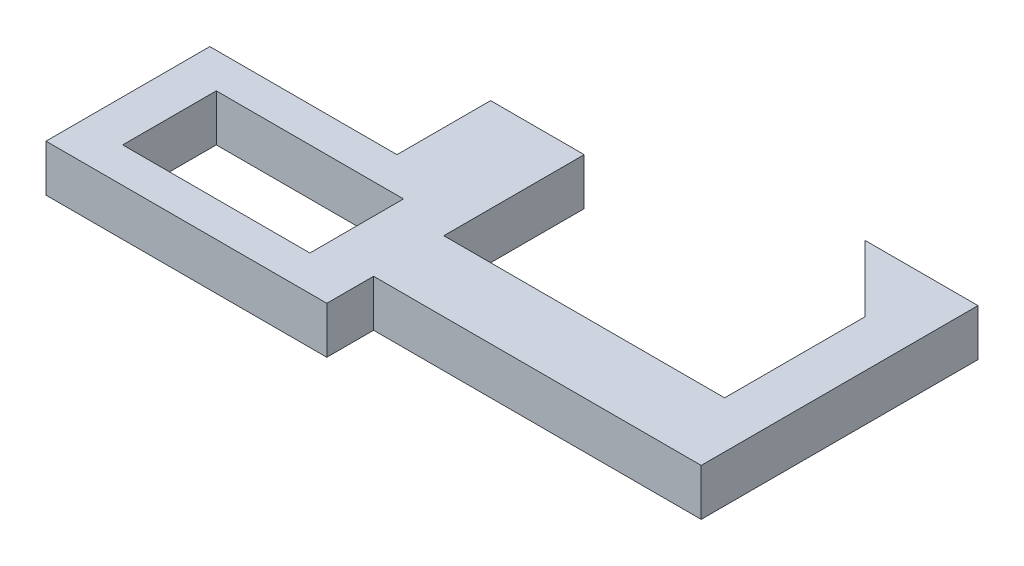
ISO-10303-21;
HEADER;
FILE_DESCRIPTION(('STEP AP214'),'2;1');
FILE_NAME('part.step','',(''),(''),'','','');
FILE_SCHEMA(('AUTOMOTIVE_DESIGN { 1 0 10303 214 1 1 1 1 }'));
ENDSEC;
DATA;
#1=APPLICATION_CONTEXT('core data for automotive mechanical design processes');
#2=APPLICATION_PROTOCOL_DEFINITION('international standard','automotive_design',2000,#1);
#3=PRODUCT_CONTEXT('',#1,'mechanical');
#4=PRODUCT('Part','Part','',(#3));
#5=PRODUCT_RELATED_PRODUCT_CATEGORY('part','',(#4));
#6=PRODUCT_DEFINITION_FORMATION('','',#4);
#7=PRODUCT_DEFINITION_CONTEXT('part definition',#1,'design');
#8=PRODUCT_DEFINITION('design','',#6,#7);
#9=PRODUCT_DEFINITION_SHAPE('','',#8);
#10=(LENGTH_UNIT() NAMED_UNIT(*) SI_UNIT(.MILLI.,.METRE.));
#11=(NAMED_UNIT(*) PLANE_ANGLE_UNIT() SI_UNIT($,.RADIAN.));
#12=(NAMED_UNIT(*) SI_UNIT($,.STERADIAN.) SOLID_ANGLE_UNIT());
#13=UNCERTAINTY_MEASURE_WITH_UNIT(LENGTH_MEASURE(1.E-05),#10,'distance_accuracy_value','');
#14=(GEOMETRIC_REPRESENTATION_CONTEXT(3) GLOBAL_UNCERTAINTY_ASSIGNED_CONTEXT((#13)) GLOBAL_UNIT_ASSIGNED_CONTEXT((#10,
#11,#12)) REPRESENTATION_CONTEXT('',''));
#15=CARTESIAN_POINT('',(0.,0.,0.));
#16=DIRECTION('',(0.,0.,1.));
#17=DIRECTION('',(1.,0.,0.));
#18=AXIS2_PLACEMENT_3D('',#15,#16,#17);
#19=CARTESIAN_POINT('',(0.,0.5,-22.6921827779806));
#20=DIRECTION('',(0.,0.,1.));
#21=DIRECTION('',(1.,0.,0.));
#22=AXIS2_PLACEMENT_3D('',#19,#20,#21);
#23=PLANE('',#22);
#24=DIRECTION('',(-1.,0.,0.));
#25=VECTOR('',#24,1.);
#26=CARTESIAN_POINT('',(0.,0.,-22.6921827779806));
#27=LINE('',#26,#25);
#28=CARTESIAN_POINT('',(-28.9732967707679,0.,-22.6921827779806));
#29=VERTEX_POINT('',#28);
#30=CARTESIAN_POINT('',(-30.9732967707679,0.,-22.6921827779806));
#31=VERTEX_POINT('',#30);
#32=EDGE_CURVE('E304',#29,#31,#27,.T.);
#33=ORIENTED_EDGE('',*,*,#32,.T.);
#34=DIRECTION('',(0.,-1.,0.));
#35=VECTOR('',#34,1.);
#36=CARTESIAN_POINT('',(-30.9732967707679,0.5,-22.6921827779806));
#37=LINE('',#36,#35);
#38=CARTESIAN_POINT('',(-30.9732967707679,0.5,-22.6921827779806));
#39=VERTEX_POINT('',#38);
#40=EDGE_CURVE('E11',#39,#31,#37,.T.);
#41=ORIENTED_EDGE('',*,*,#40,.F.);
#42=DIRECTION('',(-1.,0.,0.));
#43=VECTOR('',#42,1.);
#44=CARTESIAN_POINT('',(0.,0.5,-22.6921827779806));
#45=LINE('',#44,#43);
#46=CARTESIAN_POINT('',(-28.9732967707679,0.5,-22.6921827779806));
#47=VERTEX_POINT('',#46);
#48=EDGE_CURVE('E215',#47,#39,#45,.T.);
#49=ORIENTED_EDGE('',*,*,#48,.F.);
#50=DIRECTION('',(0.,-1.,0.));
#51=VECTOR('',#50,1.);
#52=CARTESIAN_POINT('',(-28.9732967707679,0.5,-22.6921827779806));
#53=LINE('',#52,#51);
#54=EDGE_CURVE('E239',#47,#29,#53,.T.);
#55=ORIENTED_EDGE('',*,*,#54,.T.);
#56=EDGE_LOOP('',(#33,#41,#49,#55));
#57=FACE_BOUND('',#56,.T.);
#58=ADVANCED_FACE('F41',(#57),#23,.F.);
#59=CARTESIAN_POINT('',(-30.9732967707679,0.5,0.));
#60=DIRECTION('',(-1.,0.,0.));
#61=DIRECTION('',(0.,0.,1.));
#62=AXIS2_PLACEMENT_3D('',#59,#60,#61);
#63=PLANE('',#62);
#64=DIRECTION('',(0.,0.,-1.));
#65=VECTOR('',#64,1.);
#66=CARTESIAN_POINT('',(-30.9732967707679,0.,0.));
#67=LINE('',#66,#65);
#68=CARTESIAN_POINT('',(-30.9732967707679,0.,-20.9421827779806));
#69=VERTEX_POINT('',#68);
#70=EDGE_CURVE('E308',#69,#31,#67,.T.);
#71=ORIENTED_EDGE('',*,*,#70,.F.);
#72=DIRECTION('',(0.,-1.,0.));
#73=VECTOR('',#72,1.);
#74=CARTESIAN_POINT('',(-30.9732967707679,0.5,-20.9421827779806));
#75=LINE('',#74,#73);
#76=CARTESIAN_POINT('',(-30.9732967707679,0.5,-20.9421827779806));
#77=VERTEX_POINT('',#76);
#78=EDGE_CURVE('E52',#77,#69,#75,.T.);
#79=ORIENTED_EDGE('',*,*,#78,.F.);
#80=DIRECTION('',(0.,0.,-1.));
#81=VECTOR('',#80,1.);
#82=CARTESIAN_POINT('',(-30.9732967707679,0.5,0.));
#83=LINE('',#82,#81);
#84=EDGE_CURVE('E210',#77,#39,#83,.T.);
#85=ORIENTED_EDGE('',*,*,#84,.T.);
#86=ORIENTED_EDGE('',*,*,#40,.T.);
#87=EDGE_LOOP('',(#71,#79,#85,#86));
#88=FACE_BOUND('',#87,.T.);
#89=ADVANCED_FACE('F367',(#88),#63,.T.);
#90=CARTESIAN_POINT('',(0.,0.5,-20.9421827779806));
#91=DIRECTION('',(0.,0.,1.));
#92=DIRECTION('',(1.,0.,0.));
#93=AXIS2_PLACEMENT_3D('',#90,#91,#92);
#94=PLANE('',#93);
#95=DIRECTION('',(-1.,0.,0.));
#96=VECTOR('',#95,1.);
#97=CARTESIAN_POINT('',(0.,0.,-20.9421827779806));
#98=LINE('',#97,#96);
#99=CARTESIAN_POINT('',(-27.9732967707679,0.,-20.9421827779806));
#100=VERTEX_POINT('',#99);
#101=EDGE_CURVE('E312',#100,#69,#98,.T.);
#102=ORIENTED_EDGE('',*,*,#101,.F.);
#103=DIRECTION('',(0.,-1.,0.));
#104=VECTOR('',#103,1.);
#105=CARTESIAN_POINT('',(-27.9732967707679,0.5,-20.9421827779806));
#106=LINE('',#105,#104);
#107=CARTESIAN_POINT('',(-27.9732967707679,0.5,-20.9421827779806));
#108=VERTEX_POINT('',#107);
#109=EDGE_CURVE('E264',#108,#100,#106,.T.);
#110=ORIENTED_EDGE('',*,*,#109,.F.);
#111=DIRECTION('',(-1.,0.,0.));
#112=VECTOR('',#111,1.);
#113=CARTESIAN_POINT('',(0.,0.5,-20.9421827779806));
#114=LINE('',#113,#112);
#115=EDGE_CURVE('E203',#108,#77,#114,.T.);
#116=ORIENTED_EDGE('',*,*,#115,.T.);
#117=ORIENTED_EDGE('',*,*,#78,.T.);
#118=EDGE_LOOP('',(#102,#110,#116,#117));
#119=FACE_BOUND('',#118,.T.);
#120=ADVANCED_FACE('F372',(#119),#94,.T.);
#121=CARTESIAN_POINT('',(-27.9732967707679,0.5,0.));
#122=DIRECTION('',(1.,0.,0.));
#123=DIRECTION('',(0.,0.,-1.));
#124=AXIS2_PLACEMENT_3D('',#121,#122,#123);
#125=PLANE('',#124);
#126=DIRECTION('',(0.,0.,1.));
#127=VECTOR('',#126,1.);
#128=CARTESIAN_POINT('',(-27.9732967707679,0.,0.));
#129=LINE('',#128,#127);
#130=CARTESIAN_POINT('',(-27.9732967707679,0.,-21.4421827779806));
#131=VERTEX_POINT('',#130);
#132=EDGE_CURVE('E316',#131,#100,#129,.T.);
#133=ORIENTED_EDGE('',*,*,#132,.F.);
#134=DIRECTION('',(0.,-1.,0.));
#135=VECTOR('',#134,1.);
#136=CARTESIAN_POINT('',(-27.9732967707679,0.5,-21.4421827779806));
#137=LINE('',#136,#135);
#138=CARTESIAN_POINT('',(-27.9732967707679,0.5,-21.4421827779806));
#139=VERTEX_POINT('',#138);
#140=EDGE_CURVE('E261',#139,#131,#137,.T.);
#141=ORIENTED_EDGE('',*,*,#140,.F.);
#142=DIRECTION('',(0.,0.,1.));
#143=VECTOR('',#142,1.);
#144=CARTESIAN_POINT('',(-27.9732967707679,0.5,0.));
#145=LINE('',#144,#143);
#146=EDGE_CURVE('E194',#139,#108,#145,.T.);
#147=ORIENTED_EDGE('',*,*,#146,.T.);
#148=ORIENTED_EDGE('',*,*,#109,.T.);
#149=EDGE_LOOP('',(#133,#141,#147,#148));
#150=FACE_BOUND('',#149,.T.);
#151=ADVANCED_FACE('F390',(#150),#125,.T.);
#152=CARTESIAN_POINT('',(0.,0.5,-21.4421827779806));
#153=DIRECTION('',(0.,0.,-1.));
#154=DIRECTION('',(-1.,0.,0.));
#155=AXIS2_PLACEMENT_3D('',#152,#153,#154);
#156=PLANE('',#155);
#157=DIRECTION('',(1.,0.,0.));
#158=VECTOR('',#157,1.);
#159=CARTESIAN_POINT('',(0.,0.,-21.4421827779806));
#160=LINE('',#159,#158);
#161=CARTESIAN_POINT('',(-24.4732967707679,0.,-21.4421827779806));
#162=VERTEX_POINT('',#161);
#163=EDGE_CURVE('E320',#131,#162,#160,.T.);
#164=ORIENTED_EDGE('',*,*,#163,.T.);
#165=DIRECTION('',(0.,-1.,0.));
#166=VECTOR('',#165,1.);
#167=CARTESIAN_POINT('',(-24.4732967707679,0.5,-21.4421827779806));
#168=LINE('',#167,#166);
#169=CARTESIAN_POINT('',(-24.4732967707679,0.5,-21.4421827779806));
#170=VERTEX_POINT('',#169);
#171=EDGE_CURVE('E258',#170,#162,#168,.T.);
#172=ORIENTED_EDGE('',*,*,#171,.F.);
#173=DIRECTION('',(1.,0.,0.));
#174=VECTOR('',#173,1.);
#175=CARTESIAN_POINT('',(0.,0.5,-21.4421827779806));
#176=LINE('',#175,#174);
#177=EDGE_CURVE('E202',#139,#170,#176,.T.);
#178=ORIENTED_EDGE('',*,*,#177,.F.);
#179=ORIENTED_EDGE('',*,*,#140,.T.);
#180=EDGE_LOOP('',(#164,#172,#178,#179));
#181=FACE_BOUND('',#180,.T.);
#182=ADVANCED_FACE('F410',(#181),#156,.F.);
#183=CARTESIAN_POINT('',(-24.4732967707679,0.5,0.));
#184=DIRECTION('',(1.,0.,0.));
#185=DIRECTION('',(0.,0.,-1.));
#186=AXIS2_PLACEMENT_3D('',#183,#184,#185);
#187=PLANE('',#186);
#188=DIRECTION('',(0.,0.,1.));
#189=VECTOR('',#188,1.);
#190=CARTESIAN_POINT('',(-24.4732967707679,0.,0.));
#191=LINE('',#190,#189);
#192=CARTESIAN_POINT('',(-24.4732967707679,0.,-24.3992895591672));
#193=VERTEX_POINT('',#192);
#194=EDGE_CURVE('E324',#193,#162,#191,.T.);
#195=ORIENTED_EDGE('',*,*,#194,.F.);
#196=DIRECTION('',(0.,-1.,0.));
#197=VECTOR('',#196,1.);
#198=CARTESIAN_POINT('',(-24.4732967707679,0.5,-24.3992895591672));
#199=LINE('',#198,#197);
#200=CARTESIAN_POINT('',(-24.4732967707679,0.5,-24.3992895591672));
#201=VERTEX_POINT('',#200);
#202=EDGE_CURVE('E255',#201,#193,#199,.T.);
#203=ORIENTED_EDGE('',*,*,#202,.F.);
#204=DIRECTION('',(0.,0.,1.));
#205=VECTOR('',#204,1.);
#206=CARTESIAN_POINT('',(-24.4732967707679,0.5,0.));
#207=LINE('',#206,#205);
#208=EDGE_CURVE('E208',#201,#170,#207,.T.);
#209=ORIENTED_EDGE('',*,*,#208,.T.);
#210=ORIENTED_EDGE('',*,*,#171,.T.);
#211=EDGE_LOOP('',(#195,#203,#209,#210));
#212=FACE_BOUND('',#211,.T.);
#213=ADVANCED_FACE('F406',(#212),#187,.T.);
#214=CARTESIAN_POINT('',(0.,0.5,-24.3992895591672));
#215=DIRECTION('',(0.,0.,-1.));
#216=DIRECTION('',(-1.,0.,0.));
#217=AXIS2_PLACEMENT_3D('',#214,#215,#216);
#218=PLANE('',#217);
#219=DIRECTION('',(1.,0.,0.));
#220=VECTOR('',#219,1.);
#221=CARTESIAN_POINT('',(0.,0.,-24.3992895591672));
#222=LINE('',#221,#220);
#223=CARTESIAN_POINT('',(-25.6804035519545,0.,-24.3992895591672));
#224=VERTEX_POINT('',#223);
#225=EDGE_CURVE('E328',#224,#193,#222,.T.);
#226=ORIENTED_EDGE('',*,*,#225,.F.);
#227=DIRECTION('',(0.,-1.,0.));
#228=VECTOR('',#227,1.);
#229=CARTESIAN_POINT('',(-25.6804035519545,0.5,-24.3992895591672));
#230=LINE('',#229,#228);
#231=CARTESIAN_POINT('',(-25.6804035519545,0.5,-24.3992895591672));
#232=VERTEX_POINT('',#231);
#233=EDGE_CURVE('E252',#232,#224,#230,.T.);
#234=ORIENTED_EDGE('',*,*,#233,.F.);
#235=DIRECTION('',(1.,0.,0.));
#236=VECTOR('',#235,1.);
#237=CARTESIAN_POINT('',(0.,0.5,-24.3992895591672));
#238=LINE('',#237,#236);
#239=EDGE_CURVE('E429',#232,#201,#238,.T.);
#240=ORIENTED_EDGE('',*,*,#239,.T.);
#241=ORIENTED_EDGE('',*,*,#202,.T.);
#242=EDGE_LOOP('',(#226,#234,#240,#241));
#243=FACE_BOUND('',#242,.T.);
#244=ADVANCED_FACE('F402',(#243),#218,.T.);
#245=CARTESIAN_POINT('',(-0.640556996393652,0.5,0.640556996393652));
#246=DIRECTION('',(-0.707106781186547,0.,0.707106781186547));
#247=DIRECTION('',(0.707106781186548,0.,0.707106781186548));
#248=AXIS2_PLACEMENT_3D('',#245,#246,#247);
#249=PLANE('',#248);
#250=DIRECTION('',(-0.707106781186548,0.,-0.707106781186548));
#251=VECTOR('',#250,1.);
#252=CARTESIAN_POINT('',(-0.640556996393652,0.,0.640556996393652));
#253=LINE('',#252,#251);
#254=CARTESIAN_POINT('',(-24.9732967707679,0.,-23.6921827779806));
#255=VERTEX_POINT('',#254);
#256=EDGE_CURVE('E332',#255,#224,#253,.T.);
#257=ORIENTED_EDGE('',*,*,#256,.F.);
#258=DIRECTION('',(0.,-1.,0.));
#259=VECTOR('',#258,1.);
#260=CARTESIAN_POINT('',(-24.9732967707679,0.5,-23.6921827779806));
#261=LINE('',#260,#259);
#262=CARTESIAN_POINT('',(-24.9732967707679,0.5,-23.6921827779806));
#263=VERTEX_POINT('',#262);
#264=EDGE_CURVE('E249',#263,#255,#261,.T.);
#265=ORIENTED_EDGE('',*,*,#264,.F.);
#266=DIRECTION('',(-0.707106781186548,0.,-0.707106781186548));
#267=VECTOR('',#266,1.);
#268=CARTESIAN_POINT('',(-0.640556996393652,0.5,0.640556996393652));
#269=LINE('',#268,#267);
#270=EDGE_CURVE('E436',#263,#232,#269,.T.);
#271=ORIENTED_EDGE('',*,*,#270,.T.);
#272=ORIENTED_EDGE('',*,*,#233,.T.);
#273=EDGE_LOOP('',(#257,#265,#271,#272));
#274=FACE_BOUND('',#273,.T.);
#275=ADVANCED_FACE('F398',(#274),#249,.T.);
#276=CARTESIAN_POINT('',(-24.9732967707679,0.5,0.));
#277=DIRECTION('',(-1.,0.,0.));
#278=DIRECTION('',(0.,0.,1.));
#279=AXIS2_PLACEMENT_3D('',#276,#277,#278);
#280=PLANE('',#279);
#281=DIRECTION('',(0.,0.,-1.));
#282=VECTOR('',#281,1.);
#283=CARTESIAN_POINT('',(-24.9732967707679,0.,0.));
#284=LINE('',#283,#282);
#285=CARTESIAN_POINT('',(-24.9732967707679,0.,-22.1921827779806));
#286=VERTEX_POINT('',#285);
#287=EDGE_CURVE('E336',#286,#255,#284,.T.);
#288=ORIENTED_EDGE('',*,*,#287,.F.);
#289=DIRECTION('',(0.,-1.,0.));
#290=VECTOR('',#289,1.);
#291=CARTESIAN_POINT('',(-24.9732967707679,0.5,-22.1921827779806));
#292=LINE('',#291,#290);
#293=CARTESIAN_POINT('',(-24.9732967707679,0.5,-22.1921827779806));
#294=VERTEX_POINT('',#293);
#295=EDGE_CURVE('E246',#294,#286,#292,.T.);
#296=ORIENTED_EDGE('',*,*,#295,.F.);
#297=DIRECTION('',(0.,0.,-1.));
#298=VECTOR('',#297,1.);
#299=CARTESIAN_POINT('',(-24.9732967707679,0.5,0.));
#300=LINE('',#299,#298);
#301=EDGE_CURVE('E196',#294,#263,#300,.T.);
#302=ORIENTED_EDGE('',*,*,#301,.T.);
#303=ORIENTED_EDGE('',*,*,#264,.T.);
#304=EDGE_LOOP('',(#288,#296,#302,#303));
#305=FACE_BOUND('',#304,.T.);
#306=ADVANCED_FACE('F394',(#305),#280,.T.);
#307=CARTESIAN_POINT('',(0.,0.5,-22.1921827779806));
#308=DIRECTION('',(0.,0.,-1.));
#309=DIRECTION('',(-1.,0.,0.));
#310=AXIS2_PLACEMENT_3D('',#307,#308,#309);
#311=PLANE('',#310);
#312=DIRECTION('',(1.,0.,0.));
#313=VECTOR('',#312,1.);
#314=CARTESIAN_POINT('',(0.,0.,-22.1921827779806));
#315=LINE('',#314,#313);
#316=CARTESIAN_POINT('',(-27.9732967707679,0.,-22.1921827779806));
#317=VERTEX_POINT('',#316);
#318=EDGE_CURVE('E339',#317,#286,#315,.T.);
#319=ORIENTED_EDGE('',*,*,#318,.F.);
#320=DIRECTION('',(0.,-1.,0.));
#321=VECTOR('',#320,1.);
#322=CARTESIAN_POINT('',(-27.9732967707679,0.5,-22.1921827779806));
#323=LINE('',#322,#321);
#324=CARTESIAN_POINT('',(-27.9732967707679,0.5,-22.1921827779806));
#325=VERTEX_POINT('',#324);
#326=EDGE_CURVE('E180',#325,#317,#323,.T.);
#327=ORIENTED_EDGE('',*,*,#326,.F.);
#328=DIRECTION('',(1.,0.,0.));
#329=VECTOR('',#328,1.);
#330=CARTESIAN_POINT('',(0.,0.5,-22.1921827779806));
#331=LINE('',#330,#329);
#332=EDGE_CURVE('E191',#325,#294,#331,.T.);
#333=ORIENTED_EDGE('',*,*,#332,.T.);
#334=ORIENTED_EDGE('',*,*,#295,.T.);
#335=EDGE_LOOP('',(#319,#327,#333,#334));
#336=FACE_BOUND('',#335,.T.);
#337=ADVANCED_FACE('F388',(#336),#311,.T.);
#338=CARTESIAN_POINT('',(-27.9732967707679,0.,-23.6921827779806));
#339=VERTEX_POINT('',#338);
#340=EDGE_CURVE('E178',#339,#317,#129,.T.);
#341=ORIENTED_EDGE('',*,*,#340,.F.);
#342=DIRECTION('',(0.,-1.,0.));
#343=VECTOR('',#342,1.);
#344=CARTESIAN_POINT('',(-27.9732967707679,0.5,-23.6921827779806));
#345=LINE('',#344,#343);
#346=CARTESIAN_POINT('',(-27.9732967707679,0.5,-23.6921827779806));
#347=VERTEX_POINT('',#346);
#348=EDGE_CURVE('E172',#347,#339,#345,.T.);
#349=ORIENTED_EDGE('',*,*,#348,.F.);
#350=EDGE_CURVE('E176',#347,#325,#145,.T.);
#351=ORIENTED_EDGE('',*,*,#350,.T.);
#352=ORIENTED_EDGE('',*,*,#326,.T.);
#353=EDGE_LOOP('',(#341,#349,#351,#352));
#354=FACE_BOUND('',#353,.T.);
#355=ADVANCED_FACE('F174',(#354),#125,.T.);
#356=CARTESIAN_POINT('',(0.,0.5,-23.6921827779806));
#357=DIRECTION('',(0.,0.,1.));
#358=DIRECTION('',(1.,0.,0.));
#359=AXIS2_PLACEMENT_3D('',#356,#357,#358);
#360=PLANE('',#359);
#361=DIRECTION('',(-1.,0.,0.));
#362=VECTOR('',#361,1.);
#363=CARTESIAN_POINT('',(0.,0.,-23.6921827779806));
#364=LINE('',#363,#362);
#365=CARTESIAN_POINT('',(-28.9732967707679,0.,-23.6921827779806));
#366=VERTEX_POINT('',#365);
#367=EDGE_CURVE('E115',#339,#366,#364,.T.);
#368=ORIENTED_EDGE('',*,*,#367,.T.);
#369=DIRECTION('',(0.,-1.,0.));
#370=VECTOR('',#369,1.);
#371=CARTESIAN_POINT('',(-28.9732967707679,0.5,-23.6921827779806));
#372=LINE('',#371,#370);
#373=CARTESIAN_POINT('',(-28.9732967707679,0.5,-23.6921827779806));
#374=VERTEX_POINT('',#373);
#375=EDGE_CURVE('E181',#374,#366,#372,.T.);
#376=ORIENTED_EDGE('',*,*,#375,.F.);
#377=DIRECTION('',(-1.,0.,0.));
#378=VECTOR('',#377,1.);
#379=CARTESIAN_POINT('',(0.,0.5,-23.6921827779806));
#380=LINE('',#379,#378);
#381=EDGE_CURVE('E183',#347,#374,#380,.T.);
#382=ORIENTED_EDGE('',*,*,#381,.F.);
#383=ORIENTED_EDGE('',*,*,#348,.T.);
#384=EDGE_LOOP('',(#368,#376,#382,#383));
#385=FACE_BOUND('',#384,.T.);
#386=ADVANCED_FACE('F184',(#385),#360,.F.);
#387=CARTESIAN_POINT('',(0.,0.5,-21.3171827779806));
#388=DIRECTION('',(0.,0.,1.));
#389=DIRECTION('',(1.,0.,0.));
#390=AXIS2_PLACEMENT_3D('',#387,#388,#389);
#391=PLANE('',#390);
#392=DIRECTION('',(-1.,0.,0.));
#393=VECTOR('',#392,1.);
#394=CARTESIAN_POINT('',(0.,0.,-21.3171827779806));
#395=LINE('',#394,#393);
#396=CARTESIAN_POINT('',(-28.5288459526355,0.,-21.3171827779806));
#397=VERTEX_POINT('',#396);
#398=CARTESIAN_POINT('',(-30.5288459526355,0.,-21.3171827779806));
#399=VERTEX_POINT('',#398);
#400=EDGE_CURVE('E288',#397,#399,#395,.T.);
#401=ORIENTED_EDGE('',*,*,#400,.T.);
#402=DIRECTION('',(0.,-1.,0.));
#403=VECTOR('',#402,1.);
#404=CARTESIAN_POINT('',(-30.5288459526355,0.5,-21.3171827779806));
#405=LINE('',#404,#403);
#406=CARTESIAN_POINT('',(-30.5288459526355,0.5,-21.3171827779806));
#407=VERTEX_POINT('',#406);
#408=EDGE_CURVE('E45',#407,#399,#405,.T.);
#409=ORIENTED_EDGE('',*,*,#408,.F.);
#410=DIRECTION('',(-1.,0.,0.));
#411=VECTOR('',#410,1.);
#412=CARTESIAN_POINT('',(0.,0.5,-21.3171827779806));
#413=LINE('',#412,#411);
#414=CARTESIAN_POINT('',(-28.5288459526355,0.5,-21.3171827779806));
#415=VERTEX_POINT('',#414);
#416=EDGE_CURVE('E228',#415,#407,#413,.T.);
#417=ORIENTED_EDGE('',*,*,#416,.F.);
#418=DIRECTION('',(0.,-1.,0.));
#419=VECTOR('',#418,1.);
#420=CARTESIAN_POINT('',(-28.5288459526355,0.5,-21.3171827779806));
#421=LINE('',#420,#419);
#422=EDGE_CURVE('E269',#415,#397,#421,.T.);
#423=ORIENTED_EDGE('',*,*,#422,.T.);
#424=EDGE_LOOP('',(#401,#409,#417,#423));
#425=FACE_BOUND('',#424,.T.);
#426=ADVANCED_FACE('F43',(#425),#391,.F.);
#427=CARTESIAN_POINT('',(-30.5288459526355,0.5,0.));
#428=DIRECTION('',(-1.,0.,0.));
#429=DIRECTION('',(0.,0.,1.));
#430=AXIS2_PLACEMENT_3D('',#427,#428,#429);
#431=PLANE('',#430);
#432=DIRECTION('',(0.,0.,-1.));
#433=VECTOR('',#432,1.);
#434=CARTESIAN_POINT('',(-30.5288459526355,0.,0.));
#435=LINE('',#434,#433);
#436=CARTESIAN_POINT('',(-30.5288459526355,0.,-22.3171827779806));
#437=VERTEX_POINT('',#436);
#438=EDGE_CURVE('E285',#399,#437,#435,.T.);
#439=ORIENTED_EDGE('',*,*,#438,.T.);
#440=DIRECTION('',(0.,-1.,0.));
#441=VECTOR('',#440,1.);
#442=CARTESIAN_POINT('',(-30.5288459526355,0.5,-22.3171827779806));
#443=LINE('',#442,#441);
#444=CARTESIAN_POINT('',(-30.5288459526355,0.5,-22.3171827779806));
#445=VERTEX_POINT('',#444);
#446=EDGE_CURVE('E276',#445,#437,#443,.T.);
#447=ORIENTED_EDGE('',*,*,#446,.F.);
#448=DIRECTION('',(0.,0.,-1.));
#449=VECTOR('',#448,1.);
#450=CARTESIAN_POINT('',(-30.5288459526355,0.5,0.));
#451=LINE('',#450,#449);
#452=EDGE_CURVE('E130',#407,#445,#451,.T.);
#453=ORIENTED_EDGE('',*,*,#452,.F.);
#454=ORIENTED_EDGE('',*,*,#408,.T.);
#455=EDGE_LOOP('',(#439,#447,#453,#454));
#456=FACE_BOUND('',#455,.T.);
#457=ADVANCED_FACE('F284',(#456),#431,.F.);
#458=CARTESIAN_POINT('',(0.,0.5,-22.3171827779806));
#459=DIRECTION('',(0.,0.,-1.));
#460=DIRECTION('',(-1.,0.,0.));
#461=AXIS2_PLACEMENT_3D('',#458,#459,#460);
#462=PLANE('',#461);
#463=DIRECTION('',(1.,0.,0.));
#464=VECTOR('',#463,1.);
#465=CARTESIAN_POINT('',(0.,0.,-22.3171827779806));
#466=LINE('',#465,#464);
#467=CARTESIAN_POINT('',(-28.5288459526355,0.,-22.3171827779806));
#468=VERTEX_POINT('',#467);
#469=EDGE_CURVE('E295',#437,#468,#466,.T.);
#470=ORIENTED_EDGE('',*,*,#469,.T.);
#471=DIRECTION('',(0.,-1.,0.));
#472=VECTOR('',#471,1.);
#473=CARTESIAN_POINT('',(-28.5288459526355,0.5,-22.3171827779806));
#474=LINE('',#473,#472);
#475=CARTESIAN_POINT('',(-28.5288459526355,0.5,-22.3171827779806));
#476=VERTEX_POINT('',#475);
#477=EDGE_CURVE('E273',#476,#468,#474,.T.);
#478=ORIENTED_EDGE('',*,*,#477,.F.);
#479=DIRECTION('',(1.,0.,0.));
#480=VECTOR('',#479,1.);
#481=CARTESIAN_POINT('',(0.,0.5,-22.3171827779806));
#482=LINE('',#481,#480);
#483=EDGE_CURVE('E223',#445,#476,#482,.T.);
#484=ORIENTED_EDGE('',*,*,#483,.F.);
#485=ORIENTED_EDGE('',*,*,#446,.T.);
#486=EDGE_LOOP('',(#470,#478,#484,#485));
#487=FACE_BOUND('',#486,.T.);
#488=ADVANCED_FACE('F361',(#487),#462,.F.);
#489=CARTESIAN_POINT('',(-28.5288459526355,0.5,0.));
#490=DIRECTION('',(1.,0.,0.));
#491=DIRECTION('',(0.,0.,-1.));
#492=AXIS2_PLACEMENT_3D('',#489,#490,#491);
#493=PLANE('',#492);
#494=DIRECTION('',(0.,0.,1.));
#495=VECTOR('',#494,1.);
#496=CARTESIAN_POINT('',(-28.5288459526355,0.,0.));
#497=LINE('',#496,#495);
#498=EDGE_CURVE('E301',#468,#397,#497,.T.);
#499=ORIENTED_EDGE('',*,*,#498,.T.);
#500=ORIENTED_EDGE('',*,*,#422,.F.);
#501=DIRECTION('',(0.,0.,1.));
#502=VECTOR('',#501,1.);
#503=CARTESIAN_POINT('',(-28.5288459526355,0.5,0.));
#504=LINE('',#503,#502);
#505=EDGE_CURVE('E220',#476,#415,#504,.T.);
#506=ORIENTED_EDGE('',*,*,#505,.F.);
#507=ORIENTED_EDGE('',*,*,#477,.T.);
#508=EDGE_LOOP('',(#499,#500,#506,#507));
#509=FACE_BOUND('',#508,.T.);
#510=ADVANCED_FACE('F354',(#509),#493,.F.);
#511=CARTESIAN_POINT('',(-28.9732967707679,0.5,0.));
#512=DIRECTION('',(1.,0.,0.));
#513=DIRECTION('',(0.,0.,-1.));
#514=AXIS2_PLACEMENT_3D('',#511,#512,#513);
#515=PLANE('',#514);
#516=DIRECTION('',(0.,0.,1.));
#517=VECTOR('',#516,1.);
#518=CARTESIAN_POINT('',(-28.9732967707679,0.,0.));
#519=LINE('',#518,#517);
#520=EDGE_CURVE('E121',#366,#29,#519,.T.);
#521=ORIENTED_EDGE('',*,*,#520,.T.);
#522=ORIENTED_EDGE('',*,*,#54,.F.);
#523=DIRECTION('',(0.,0.,1.));
#524=VECTOR('',#523,1.);
#525=CARTESIAN_POINT('',(-28.9732967707679,0.5,0.));
#526=LINE('',#525,#524);
#527=EDGE_CURVE('E61',#374,#47,#526,.T.);
#528=ORIENTED_EDGE('',*,*,#527,.F.);
#529=ORIENTED_EDGE('',*,*,#375,.T.);
#530=EDGE_LOOP('',(#521,#522,#528,#529));
#531=FACE_BOUND('',#530,.T.);
#532=ADVANCED_FACE('F351',(#531),#515,.F.);
#533=CARTESIAN_POINT('',(0.,0.5,0.));
#534=DIRECTION('',(0.,1.,0.));
#535=DIRECTION('',(0.,0.,1.));
#536=AXIS2_PLACEMENT_3D('',#533,#534,#535);
#537=PLANE('',#536);
#538=ORIENTED_EDGE('',*,*,#416,.T.);
#539=ORIENTED_EDGE('',*,*,#452,.T.);
#540=ORIENTED_EDGE('',*,*,#483,.T.);
#541=ORIENTED_EDGE('',*,*,#505,.T.);
#542=EDGE_LOOP('',(#538,#539,#540,#541));
#543=FACE_BOUND('',#542,.T.);
#544=ORIENTED_EDGE('',*,*,#48,.T.);
#545=ORIENTED_EDGE('',*,*,#84,.F.);
#546=ORIENTED_EDGE('',*,*,#115,.F.);
#547=ORIENTED_EDGE('',*,*,#146,.F.);
#548=ORIENTED_EDGE('',*,*,#177,.T.);
#549=ORIENTED_EDGE('',*,*,#208,.F.);
#550=ORIENTED_EDGE('',*,*,#239,.F.);
#551=ORIENTED_EDGE('',*,*,#270,.F.);
#552=ORIENTED_EDGE('',*,*,#301,.F.);
#553=ORIENTED_EDGE('',*,*,#332,.F.);
#554=ORIENTED_EDGE('',*,*,#350,.F.);
#555=ORIENTED_EDGE('',*,*,#381,.T.);
#556=ORIENTED_EDGE('',*,*,#527,.T.);
#557=EDGE_LOOP('',(#544,#545,#546,#547,#548,#549,#550,#551,#552,#553,#554,#555,#556));
#558=FACE_BOUND('',#557,.T.);
#559=ADVANCED_FACE('F188',(#543,#558),#537,.T.);
#560=CARTESIAN_POINT('',(0.,0.,0.));
#561=DIRECTION('',(0.,1.,0.));
#562=DIRECTION('',(0.,0.,1.));
#563=AXIS2_PLACEMENT_3D('',#560,#561,#562);
#564=PLANE('',#563);
#565=ORIENTED_EDGE('',*,*,#400,.F.);
#566=ORIENTED_EDGE('',*,*,#498,.F.);
#567=ORIENTED_EDGE('',*,*,#469,.F.);
#568=ORIENTED_EDGE('',*,*,#438,.F.);
#569=EDGE_LOOP('',(#565,#566,#567,#568));
#570=FACE_BOUND('',#569,.T.);
#571=ORIENTED_EDGE('',*,*,#32,.F.);
#572=ORIENTED_EDGE('',*,*,#520,.F.);
#573=ORIENTED_EDGE('',*,*,#367,.F.);
#574=ORIENTED_EDGE('',*,*,#340,.T.);
#575=ORIENTED_EDGE('',*,*,#318,.T.);
#576=ORIENTED_EDGE('',*,*,#287,.T.);
#577=ORIENTED_EDGE('',*,*,#256,.T.);
#578=ORIENTED_EDGE('',*,*,#225,.T.);
#579=ORIENTED_EDGE('',*,*,#194,.T.);
#580=ORIENTED_EDGE('',*,*,#163,.F.);
#581=ORIENTED_EDGE('',*,*,#132,.T.);
#582=ORIENTED_EDGE('',*,*,#101,.T.);
#583=ORIENTED_EDGE('',*,*,#70,.T.);
#584=EDGE_LOOP('',(#571,#572,#573,#574,#575,#576,#577,#578,#579,#580,#581,#582,#583));
#585=FACE_BOUND('',#584,.T.);
#586=ADVANCED_FACE('F346',(#570,#585),#564,.F.);
#587=CLOSED_SHELL('',(#58,#89,#120,#151,#182,#213,#244,#275,#306,#337,#355,#386,#426,#457,#488,
#510,#532,#559,#586));
#588=MANIFOLD_SOLID_BREP('B2',#587);
#589=ADVANCED_BREP_SHAPE_REPRESENTATION('',(#18,#588),#14);
#590=SHAPE_DEFINITION_REPRESENTATION(#9,#589);
ENDSEC;
END-ISO-10303-21;
